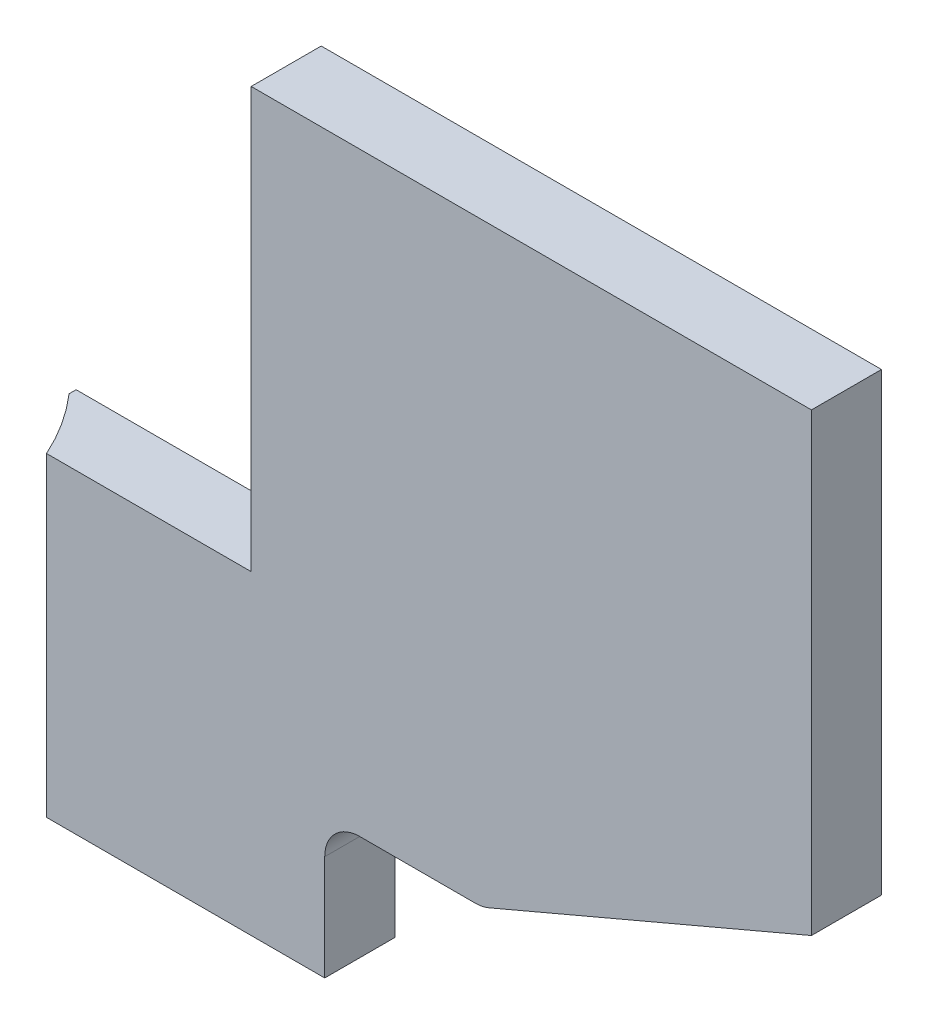
ISO-10303-21;
HEADER;
FILE_DESCRIPTION(('STEP AP214'),'2;1');
FILE_NAME('part.step','',(''),(''),'','','');
FILE_SCHEMA(('AUTOMOTIVE_DESIGN { 1 0 10303 214 1 1 1 1 }'));
ENDSEC;
DATA;
#1=APPLICATION_CONTEXT('core data for automotive mechanical design processes');
#2=APPLICATION_PROTOCOL_DEFINITION('international standard','automotive_design',2000,#1);
#3=PRODUCT_CONTEXT('',#1,'mechanical');
#4=PRODUCT('Part','Part','',(#3));
#5=PRODUCT_RELATED_PRODUCT_CATEGORY('part','',(#4));
#6=PRODUCT_DEFINITION_FORMATION('','',#4);
#7=PRODUCT_DEFINITION_CONTEXT('part definition',#1,'design');
#8=PRODUCT_DEFINITION('design','',#6,#7);
#9=PRODUCT_DEFINITION_SHAPE('','',#8);
#10=(LENGTH_UNIT() NAMED_UNIT(*) SI_UNIT(.MILLI.,.METRE.));
#11=(NAMED_UNIT(*) PLANE_ANGLE_UNIT() SI_UNIT($,.RADIAN.));
#12=(NAMED_UNIT(*) SI_UNIT($,.STERADIAN.) SOLID_ANGLE_UNIT());
#13=UNCERTAINTY_MEASURE_WITH_UNIT(LENGTH_MEASURE(1.E-05),#10,'distance_accuracy_value','');
#14=(GEOMETRIC_REPRESENTATION_CONTEXT(3) GLOBAL_UNCERTAINTY_ASSIGNED_CONTEXT((#13)) GLOBAL_UNIT_ASSIGNED_CONTEXT((#10,
#11,#12)) REPRESENTATION_CONTEXT('',''));
#15=CARTESIAN_POINT('',(0.,0.,0.));
#16=DIRECTION('',(0.,0.,1.));
#17=DIRECTION('',(1.,0.,0.));
#18=AXIS2_PLACEMENT_3D('',#15,#16,#17);
#19=CARTESIAN_POINT('',(0.,-72.5,0.));
#20=DIRECTION('',(0.,-1.,0.));
#21=DIRECTION('',(0.,0.,-1.));
#22=AXIS2_PLACEMENT_3D('',#19,#20,#21);
#23=PLANE('',#22);
#24=DIRECTION('',(1.,0.,0.));
#25=VECTOR('',#24,1.);
#26=CARTESIAN_POINT('',(-40.,-72.5,0.));
#27=LINE('',#26,#25);
#28=CARTESIAN_POINT('',(-75.,-72.5,0.));
#29=VERTEX_POINT('',#28);
#30=CARTESIAN_POINT('',(-29.5,-72.5,0.));
#31=VERTEX_POINT('',#30);
#32=EDGE_CURVE('E141',#29,#31,#27,.T.);
#33=ORIENTED_EDGE('',*,*,#32,.T.);
#34=DIRECTION('',(0.,0.,1.));
#35=VECTOR('',#34,1.);
#36=CARTESIAN_POINT('',(-29.5,-72.5,0.));
#37=LINE('',#36,#35);
#38=CARTESIAN_POINT('',(-29.5,-72.5,10.));
#39=VERTEX_POINT('',#38);
#40=EDGE_CURVE('E130',#31,#39,#37,.T.);
#41=ORIENTED_EDGE('',*,*,#40,.T.);
#42=DIRECTION('',(-1.,0.,0.));
#43=VECTOR('',#42,1.);
#44=CARTESIAN_POINT('',(-40.,-72.5,10.));
#45=LINE('',#44,#43);
#46=CARTESIAN_POINT('',(-69.2246337360503,-72.5,10.));
#47=VERTEX_POINT('',#46);
#48=EDGE_CURVE('E151',#39,#47,#45,.T.);
#49=ORIENTED_EDGE('',*,*,#48,.T.);
#50=CARTESIAN_POINT('',(-102.5,-72.5,25.));
#51=DIRECTION('',(0.,1.,0.));
#52=DIRECTION('',(-1.,0.,0.));
#53=AXIS2_PLACEMENT_3D('',#50,#51,#52);
#54=CIRCLE('',#53,36.5);
#55=CARTESIAN_POINT('',(-75.,-72.5,0.999999999999984));
#56=VERTEX_POINT('',#55);
#57=EDGE_CURVE('E204',#47,#56,#54,.T.);
#58=ORIENTED_EDGE('',*,*,#57,.T.);
#59=DIRECTION('',(0.,0.,1.));
#60=VECTOR('',#59,1.);
#61=CARTESIAN_POINT('',(-75.,-72.5,0.));
#62=LINE('',#61,#60);
#63=EDGE_CURVE('E153',#29,#56,#62,.T.);
#64=ORIENTED_EDGE('',*,*,#63,.F.);
#65=EDGE_LOOP('',(#33,#41,#49,#58,#64));
#66=FACE_BOUND('',#65,.T.);
#67=ADVANCED_FACE('F39',(#66),#23,.T.);
#68=CARTESIAN_POINT('',(40.,-32.5,10.));
#69=DIRECTION('',(-1.,0.,0.));
#70=DIRECTION('',(0.,0.,1.));
#71=AXIS2_PLACEMENT_3D('',#68,#69,#70);
#72=PLANE('',#71);
#73=DIRECTION('',(0.,0.,1.));
#74=VECTOR('',#73,1.);
#75=CARTESIAN_POINT('',(40.,-32.5,0.));
#76=LINE('',#75,#74);
#77=CARTESIAN_POINT('',(40.,-32.5,0.));
#78=VERTEX_POINT('',#77);
#79=CARTESIAN_POINT('',(40.,-32.5,10.));
#80=VERTEX_POINT('',#79);
#81=EDGE_CURVE('E140',#78,#80,#76,.T.);
#82=ORIENTED_EDGE('',*,*,#81,.F.);
#83=DIRECTION('',(0.,1.,0.));
#84=VECTOR('',#83,1.);
#85=CARTESIAN_POINT('',(40.,-32.5,0.));
#86=LINE('',#85,#84);
#87=CARTESIAN_POINT('',(40.,32.5,0.));
#88=VERTEX_POINT('',#87);
#89=EDGE_CURVE('E164',#78,#88,#86,.T.);
#90=ORIENTED_EDGE('',*,*,#89,.T.);
#91=DIRECTION('',(0.,0.,-1.));
#92=VECTOR('',#91,1.);
#93=CARTESIAN_POINT('',(40.,32.5,10.));
#94=LINE('',#93,#92);
#95=CARTESIAN_POINT('',(40.,32.5,10.));
#96=VERTEX_POINT('',#95);
#97=EDGE_CURVE('E50',#96,#88,#94,.T.);
#98=ORIENTED_EDGE('',*,*,#97,.F.);
#99=DIRECTION('',(0.,1.,0.));
#100=VECTOR('',#99,1.);
#101=CARTESIAN_POINT('',(40.,-32.5,10.));
#102=LINE('',#101,#100);
#103=EDGE_CURVE('E166',#80,#96,#102,.T.);
#104=ORIENTED_EDGE('',*,*,#103,.F.);
#105=EDGE_LOOP('',(#82,#90,#98,#104));
#106=FACE_BOUND('',#105,.T.);
#107=ADVANCED_FACE('F241',(#106),#72,.F.);
#108=CARTESIAN_POINT('',(-75.,-27.5,0.));
#109=DIRECTION('',(0.,-1.,0.));
#110=DIRECTION('',(1.,0.,0.));
#111=AXIS2_PLACEMENT_3D('',#108,#109,#110);
#112=PLANE('',#111);
#113=CARTESIAN_POINT('',(-102.5,-27.5,25.));
#114=DIRECTION('',(0.,1.,0.));
#115=DIRECTION('',(-1.,0.,0.));
#116=AXIS2_PLACEMENT_3D('',#113,#114,#115);
#117=CIRCLE('',#116,36.5);
#118=CARTESIAN_POINT('',(-69.2246337360503,-27.5,10.));
#119=VERTEX_POINT('',#118);
#120=CARTESIAN_POINT('',(-75.,-27.5,0.999999999999984));
#121=VERTEX_POINT('',#120);
#122=EDGE_CURVE('E65',#119,#121,#117,.T.);
#123=ORIENTED_EDGE('',*,*,#122,.F.);
#124=DIRECTION('',(1.,0.,0.));
#125=VECTOR('',#124,1.);
#126=CARTESIAN_POINT('',(-75.,-27.5,10.));
#127=LINE('',#126,#125);
#128=CARTESIAN_POINT('',(-40.,-27.5,10.));
#129=VERTEX_POINT('',#128);
#130=EDGE_CURVE('E152',#119,#129,#127,.T.);
#131=ORIENTED_EDGE('',*,*,#130,.T.);
#132=DIRECTION('',(0.,0.,-1.));
#133=VECTOR('',#132,1.);
#134=CARTESIAN_POINT('',(-40.,-27.5,0.));
#135=LINE('',#134,#133);
#136=CARTESIAN_POINT('',(-40.,-27.5,0.));
#137=VERTEX_POINT('',#136);
#138=EDGE_CURVE('E196',#129,#137,#135,.T.);
#139=ORIENTED_EDGE('',*,*,#138,.T.);
#140=DIRECTION('',(1.,0.,0.));
#141=VECTOR('',#140,1.);
#142=CARTESIAN_POINT('',(-75.,-27.5,0.));
#143=LINE('',#142,#141);
#144=CARTESIAN_POINT('',(-75.,-27.5,0.));
#145=VERTEX_POINT('',#144);
#146=EDGE_CURVE('E156',#145,#137,#143,.T.);
#147=ORIENTED_EDGE('',*,*,#146,.F.);
#148=DIRECTION('',(0.,0.,-1.));
#149=VECTOR('',#148,1.);
#150=CARTESIAN_POINT('',(-75.,-27.5,0.));
#151=LINE('',#150,#149);
#152=EDGE_CURVE('E193',#121,#145,#151,.T.);
#153=ORIENTED_EDGE('',*,*,#152,.F.);
#154=EDGE_LOOP('',(#123,#131,#139,#147,#153));
#155=FACE_BOUND('',#154,.T.);
#156=ADVANCED_FACE('F270',(#155),#112,.F.);
#157=CARTESIAN_POINT('',(-40.,-32.5,10.));
#158=DIRECTION('',(-1.,0.,0.));
#159=DIRECTION('',(0.,-1.,0.));
#160=AXIS2_PLACEMENT_3D('',#157,#158,#159);
#161=PLANE('',#160);
#162=ORIENTED_EDGE('',*,*,#138,.F.);
#163=DIRECTION('',(0.,1.,0.));
#164=VECTOR('',#163,1.);
#165=CARTESIAN_POINT('',(-40.,-32.5,10.));
#166=LINE('',#165,#164);
#167=CARTESIAN_POINT('',(-40.,32.5,10.));
#168=VERTEX_POINT('',#167);
#169=EDGE_CURVE('E162',#129,#168,#166,.T.);
#170=ORIENTED_EDGE('',*,*,#169,.T.);
#171=DIRECTION('',(0.,0.,-1.));
#172=VECTOR('',#171,1.);
#173=CARTESIAN_POINT('',(-40.,32.5,10.));
#174=LINE('',#173,#172);
#175=CARTESIAN_POINT('',(-40.,32.5,0.));
#176=VERTEX_POINT('',#175);
#177=EDGE_CURVE('E167',#168,#176,#174,.T.);
#178=ORIENTED_EDGE('',*,*,#177,.T.);
#179=DIRECTION('',(0.,1.,0.));
#180=VECTOR('',#179,1.);
#181=CARTESIAN_POINT('',(-40.,-32.5,0.));
#182=LINE('',#181,#180);
#183=EDGE_CURVE('E158',#137,#176,#182,.T.);
#184=ORIENTED_EDGE('',*,*,#183,.F.);
#185=EDGE_LOOP('',(#162,#170,#178,#184));
#186=FACE_BOUND('',#185,.T.);
#187=ADVANCED_FACE('F41',(#186),#161,.T.);
#188=CARTESIAN_POINT('',(-40.,32.5,10.));
#189=DIRECTION('',(0.,1.,0.));
#190=DIRECTION('',(-1.,0.,0.));
#191=AXIS2_PLACEMENT_3D('',#188,#189,#190);
#192=PLANE('',#191);
#193=DIRECTION('',(1.,0.,0.));
#194=VECTOR('',#193,1.);
#195=CARTESIAN_POINT('',(-40.,32.5,0.));
#196=LINE('',#195,#194);
#197=EDGE_CURVE('E175',#176,#88,#196,.T.);
#198=ORIENTED_EDGE('',*,*,#197,.F.);
#199=ORIENTED_EDGE('',*,*,#177,.F.);
#200=DIRECTION('',(1.,0.,0.));
#201=VECTOR('',#200,1.);
#202=CARTESIAN_POINT('',(-40.,32.5,10.));
#203=LINE('',#202,#201);
#204=EDGE_CURVE('E165',#168,#96,#203,.T.);
#205=ORIENTED_EDGE('',*,*,#204,.T.);
#206=ORIENTED_EDGE('',*,*,#97,.T.);
#207=EDGE_LOOP('',(#198,#199,#205,#206));
#208=FACE_BOUND('',#207,.T.);
#209=ADVANCED_FACE('F187',(#208),#192,.T.);
#210=CARTESIAN_POINT('',(0.,0.,10.));
#211=DIRECTION('',(0.,0.,-1.));
#212=DIRECTION('',(-1.,0.,0.));
#213=AXIS2_PLACEMENT_3D('',#210,#211,#212);
#214=PLANE('',#213);
#215=DIRECTION('',(0.,-1.,0.));
#216=VECTOR('',#215,1.);
#217=CARTESIAN_POINT('',(-29.5,-72.5,10.));
#218=LINE('',#217,#216);
#219=CARTESIAN_POINT('',(-29.5,-57.5,10.));
#220=VERTEX_POINT('',#219);
#221=EDGE_CURVE('E131',#220,#39,#218,.T.);
#222=ORIENTED_EDGE('',*,*,#221,.F.);
#223=CARTESIAN_POINT('',(-24.5,-57.5,10.));
#224=DIRECTION('',(0.,0.,1.));
#225=DIRECTION('',(-1.,0.,0.));
#226=AXIS2_PLACEMENT_3D('',#223,#224,#225);
#227=CIRCLE('',#226,5.);
#228=CARTESIAN_POINT('',(-24.5,-52.5,10.));
#229=VERTEX_POINT('',#228);
#230=EDGE_CURVE('E150',#229,#220,#227,.T.);
#231=ORIENTED_EDGE('',*,*,#230,.F.);
#232=DIRECTION('',(-1.,0.,0.));
#233=VECTOR('',#232,1.);
#234=CARTESIAN_POINT('',(-24.5,-52.5,10.));
#235=LINE('',#234,#233);
#236=CARTESIAN_POINT('',(-8.01959278912215,-52.5,10.));
#237=VERTEX_POINT('',#236);
#238=EDGE_CURVE('E217',#237,#229,#235,.T.);
#239=ORIENTED_EDGE('',*,*,#238,.F.);
#240=CARTESIAN_POINT('',(-8.01959278912215,-47.5,10.));
#241=DIRECTION('',(0.,0.,-1.));
#242=DIRECTION('',(1.,0.,0.));
#243=AXIS2_PLACEMENT_3D('',#240,#241,#242);
#244=CIRCLE('',#243,4.99999999999999);
#245=CARTESIAN_POINT('',(-6.06181696863582,-52.1007731781429,10.));
#246=VERTEX_POINT('',#245);
#247=EDGE_CURVE('E225',#246,#237,#244,.T.);
#248=ORIENTED_EDGE('',*,*,#247,.F.);
#249=DIRECTION('',(-0.920154635628579,-0.391555164097267,0.));
#250=VECTOR('',#249,1.);
#251=CARTESIAN_POINT('',(-6.06181696863582,-52.1007731781429,10.));
#252=LINE('',#251,#250);
#253=EDGE_CURVE('E224',#80,#246,#252,.T.);
#254=ORIENTED_EDGE('',*,*,#253,.F.);
#255=ORIENTED_EDGE('',*,*,#103,.T.);
#256=ORIENTED_EDGE('',*,*,#204,.F.);
#257=ORIENTED_EDGE('',*,*,#169,.F.);
#258=ORIENTED_EDGE('',*,*,#130,.F.);
#259=DIRECTION('',(0.,1.,0.));
#260=VECTOR('',#259,1.);
#261=CARTESIAN_POINT('',(-69.2246337360503,-72.5,10.));
#262=LINE('',#261,#260);
#263=EDGE_CURVE('E197',#119,#47,#262,.F.);
#264=ORIENTED_EDGE('',*,*,#263,.T.);
#265=ORIENTED_EDGE('',*,*,#48,.F.);
#266=EDGE_LOOP('',(#222,#231,#239,#248,#254,#255,#256,#257,#258,#264,#265));
#267=FACE_BOUND('',#266,.T.);
#268=ADVANCED_FACE('F243',(#267),#214,.F.);
#269=CARTESIAN_POINT('',(0.,0.,0.));
#270=DIRECTION('',(0.,0.,-1.));
#271=DIRECTION('',(-1.,0.,0.));
#272=AXIS2_PLACEMENT_3D('',#269,#270,#271);
#273=PLANE('',#272);
#274=CARTESIAN_POINT('',(-24.5,-57.5,0.));
#275=DIRECTION('',(0.,0.,1.));
#276=DIRECTION('',(-1.,0.,0.));
#277=AXIS2_PLACEMENT_3D('',#274,#275,#276);
#278=CIRCLE('',#277,5.);
#279=CARTESIAN_POINT('',(-24.5,-52.5,0.));
#280=VERTEX_POINT('',#279);
#281=CARTESIAN_POINT('',(-29.5,-57.5,0.));
#282=VERTEX_POINT('',#281);
#283=EDGE_CURVE('E136',#280,#282,#278,.T.);
#284=ORIENTED_EDGE('',*,*,#283,.T.);
#285=DIRECTION('',(0.,-1.,0.));
#286=VECTOR('',#285,1.);
#287=CARTESIAN_POINT('',(-29.5,-72.5,0.));
#288=LINE('',#287,#286);
#289=EDGE_CURVE('E128',#282,#31,#288,.T.);
#290=ORIENTED_EDGE('',*,*,#289,.T.);
#291=ORIENTED_EDGE('',*,*,#32,.F.);
#292=DIRECTION('',(0.,-1.,0.));
#293=VECTOR('',#292,1.);
#294=CARTESIAN_POINT('',(-75.,-72.5,0.));
#295=LINE('',#294,#293);
#296=EDGE_CURVE('E195',#145,#29,#295,.T.);
#297=ORIENTED_EDGE('',*,*,#296,.F.);
#298=ORIENTED_EDGE('',*,*,#146,.T.);
#299=ORIENTED_EDGE('',*,*,#183,.T.);
#300=ORIENTED_EDGE('',*,*,#197,.T.);
#301=ORIENTED_EDGE('',*,*,#89,.F.);
#302=DIRECTION('',(-0.920154635628579,-0.391555164097267,0.));
#303=VECTOR('',#302,1.);
#304=CARTESIAN_POINT('',(-6.06181696863582,-52.1007731781429,0.));
#305=LINE('',#304,#303);
#306=CARTESIAN_POINT('',(-6.06181696863582,-52.1007731781429,0.));
#307=VERTEX_POINT('',#306);
#308=EDGE_CURVE('E147',#78,#307,#305,.T.);
#309=ORIENTED_EDGE('',*,*,#308,.T.);
#310=CARTESIAN_POINT('',(-8.01959278912215,-47.5,0.));
#311=DIRECTION('',(0.,0.,-1.));
#312=DIRECTION('',(1.,0.,0.));
#313=AXIS2_PLACEMENT_3D('',#310,#311,#312);
#314=CIRCLE('',#313,4.99999999999999);
#315=CARTESIAN_POINT('',(-8.01959278912215,-52.5,0.));
#316=VERTEX_POINT('',#315);
#317=EDGE_CURVE('E233',#307,#316,#314,.T.);
#318=ORIENTED_EDGE('',*,*,#317,.T.);
#319=DIRECTION('',(-1.,0.,0.));
#320=VECTOR('',#319,1.);
#321=CARTESIAN_POINT('',(-24.5,-52.5,0.));
#322=LINE('',#321,#320);
#323=EDGE_CURVE('E53',#316,#280,#322,.T.);
#324=ORIENTED_EDGE('',*,*,#323,.T.);
#325=EDGE_LOOP('',(#284,#290,#291,#297,#298,#299,#300,#301,#309,#318,#324));
#326=FACE_BOUND('',#325,.T.);
#327=ADVANCED_FACE('F142',(#326),#273,.T.);
#328=CARTESIAN_POINT('',(-75.,0.,0.));
#329=DIRECTION('',(1.,0.,0.));
#330=DIRECTION('',(0.,1.,0.));
#331=AXIS2_PLACEMENT_3D('',#328,#329,#330);
#332=PLANE('',#331);
#333=ORIENTED_EDGE('',*,*,#63,.T.);
#334=DIRECTION('',(0.,1.,0.));
#335=VECTOR('',#334,1.);
#336=CARTESIAN_POINT('',(-75.,-72.5,0.999999999999987));
#337=LINE('',#336,#335);
#338=EDGE_CURVE('E11',#56,#121,#337,.T.);
#339=ORIENTED_EDGE('',*,*,#338,.T.);
#340=ORIENTED_EDGE('',*,*,#152,.T.);
#341=ORIENTED_EDGE('',*,*,#296,.T.);
#342=EDGE_LOOP('',(#333,#339,#340,#341));
#343=FACE_BOUND('',#342,.T.);
#344=ADVANCED_FACE('F273',(#343),#332,.F.);
#345=CARTESIAN_POINT('',(-102.5,-72.5,25.));
#346=DIRECTION('',(0.,1.,0.));
#347=DIRECTION('',(-1.,0.,0.));
#348=AXIS2_PLACEMENT_3D('',#345,#346,#347);
#349=CYLINDRICAL_SURFACE('',#348,36.5);
#350=ORIENTED_EDGE('',*,*,#122,.T.);
#351=ORIENTED_EDGE('',*,*,#338,.F.);
#352=ORIENTED_EDGE('',*,*,#57,.F.);
#353=ORIENTED_EDGE('',*,*,#263,.F.);
#354=EDGE_LOOP('',(#350,#351,#352,#353));
#355=FACE_BOUND('',#354,.T.);
#356=ADVANCED_FACE('F256',(#355),#349,.F.);
#357=CARTESIAN_POINT('',(-29.5,-72.5,0.));
#358=DIRECTION('',(-1.,0.,0.));
#359=DIRECTION('',(0.,0.,1.));
#360=AXIS2_PLACEMENT_3D('',#357,#358,#359);
#361=PLANE('',#360);
#362=ORIENTED_EDGE('',*,*,#221,.T.);
#363=ORIENTED_EDGE('',*,*,#40,.F.);
#364=ORIENTED_EDGE('',*,*,#289,.F.);
#365=DIRECTION('',(0.,0.,1.));
#366=VECTOR('',#365,1.);
#367=CARTESIAN_POINT('',(-29.5,-57.5,0.));
#368=LINE('',#367,#366);
#369=EDGE_CURVE('E210',#282,#220,#368,.T.);
#370=ORIENTED_EDGE('',*,*,#369,.T.);
#371=EDGE_LOOP('',(#362,#363,#364,#370));
#372=FACE_BOUND('',#371,.T.);
#373=ADVANCED_FACE('F126',(#372),#361,.F.);
#374=CARTESIAN_POINT('',(-24.5,-57.5,0.));
#375=DIRECTION('',(0.,0.,1.));
#376=DIRECTION('',(1.,0.,0.));
#377=AXIS2_PLACEMENT_3D('',#374,#375,#376);
#378=CYLINDRICAL_SURFACE('',#377,5.);
#379=ORIENTED_EDGE('',*,*,#230,.T.);
#380=ORIENTED_EDGE('',*,*,#369,.F.);
#381=ORIENTED_EDGE('',*,*,#283,.F.);
#382=DIRECTION('',(0.,0.,1.));
#383=VECTOR('',#382,1.);
#384=CARTESIAN_POINT('',(-24.5,-52.5,0.));
#385=LINE('',#384,#383);
#386=EDGE_CURVE('E211',#280,#229,#385,.T.);
#387=ORIENTED_EDGE('',*,*,#386,.T.);
#388=EDGE_LOOP('',(#379,#380,#381,#387));
#389=FACE_BOUND('',#388,.T.);
#390=ADVANCED_FACE('F252',(#389),#378,.F.);
#391=CARTESIAN_POINT('',(-24.5,-52.5,0.));
#392=DIRECTION('',(0.,1.,0.));
#393=DIRECTION('',(0.,0.,1.));
#394=AXIS2_PLACEMENT_3D('',#391,#392,#393);
#395=PLANE('',#394);
#396=ORIENTED_EDGE('',*,*,#238,.T.);
#397=ORIENTED_EDGE('',*,*,#386,.F.);
#398=ORIENTED_EDGE('',*,*,#323,.F.);
#399=DIRECTION('',(0.,0.,1.));
#400=VECTOR('',#399,1.);
#401=CARTESIAN_POINT('',(-8.01959278912215,-52.5,0.));
#402=LINE('',#401,#400);
#403=EDGE_CURVE('E215',#316,#237,#402,.T.);
#404=ORIENTED_EDGE('',*,*,#403,.T.);
#405=EDGE_LOOP('',(#396,#397,#398,#404));
#406=FACE_BOUND('',#405,.T.);
#407=ADVANCED_FACE('F248',(#406),#395,.F.);
#408=CARTESIAN_POINT('',(-8.01959278912215,-47.5,0.));
#409=DIRECTION('',(0.,0.,1.));
#410=DIRECTION('',(1.,0.,0.));
#411=AXIS2_PLACEMENT_3D('',#408,#409,#410);
#412=CYLINDRICAL_SURFACE('',#411,4.99999999999999);
#413=ORIENTED_EDGE('',*,*,#247,.T.);
#414=ORIENTED_EDGE('',*,*,#403,.F.);
#415=ORIENTED_EDGE('',*,*,#317,.F.);
#416=DIRECTION('',(0.,0.,1.));
#417=VECTOR('',#416,1.);
#418=CARTESIAN_POINT('',(-6.06181696863582,-52.1007731781429,0.));
#419=LINE('',#418,#417);
#420=EDGE_CURVE('E208',#307,#246,#419,.T.);
#421=ORIENTED_EDGE('',*,*,#420,.T.);
#422=EDGE_LOOP('',(#413,#414,#415,#421));
#423=FACE_BOUND('',#422,.T.);
#424=ADVANCED_FACE('F247',(#423),#412,.T.);
#425=CARTESIAN_POINT('',(-6.06181696863582,-52.1007731781429,0.));
#426=DIRECTION('',(-0.391555164097267,0.920154635628579,0.));
#427=DIRECTION('',(-0.920154635628579,-0.391555164097267,0.));
#428=AXIS2_PLACEMENT_3D('',#425,#426,#427);
#429=PLANE('',#428);
#430=ORIENTED_EDGE('',*,*,#253,.T.);
#431=ORIENTED_EDGE('',*,*,#420,.F.);
#432=ORIENTED_EDGE('',*,*,#308,.F.);
#433=ORIENTED_EDGE('',*,*,#81,.T.);
#434=EDGE_LOOP('',(#430,#431,#432,#433));
#435=FACE_BOUND('',#434,.T.);
#436=ADVANCED_FACE('F240',(#435),#429,.F.);
#437=CLOSED_SHELL('',(#67,#107,#156,#187,#209,#268,#327,#344,#356,#373,#390,#407,#424,#436));
#438=MANIFOLD_SOLID_BREP('B2',#437);
#439=ADVANCED_BREP_SHAPE_REPRESENTATION('',(#18,#438),#14);
#440=SHAPE_DEFINITION_REPRESENTATION(#9,#439);
ENDSEC;
END-ISO-10303-21;
